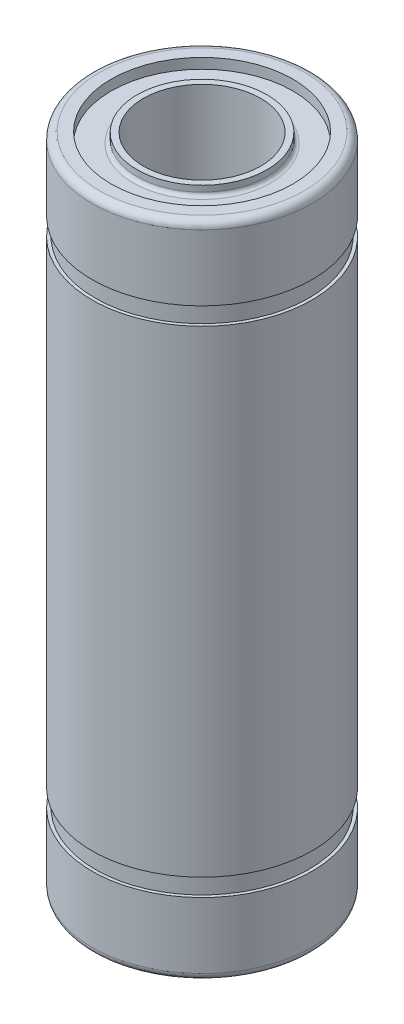
ISO-10303-21;
HEADER;
FILE_DESCRIPTION(('STEP AP214'),'2;1');
FILE_NAME('part.step','',(''),(''),'','','');
FILE_SCHEMA(('AUTOMOTIVE_DESIGN { 1 0 10303 214 1 1 1 1 }'));
ENDSEC;
DATA;
#1=APPLICATION_CONTEXT('core data for automotive mechanical design processes');
#2=APPLICATION_PROTOCOL_DEFINITION('international standard','automotive_design',2000,#1);
#3=PRODUCT_CONTEXT('',#1,'mechanical');
#4=PRODUCT('Part','Part','',(#3));
#5=PRODUCT_RELATED_PRODUCT_CATEGORY('part','',(#4));
#6=PRODUCT_DEFINITION_FORMATION('','',#4);
#7=PRODUCT_DEFINITION_CONTEXT('part definition',#1,'design');
#8=PRODUCT_DEFINITION('design','',#6,#7);
#9=PRODUCT_DEFINITION_SHAPE('','',#8);
#10=(LENGTH_UNIT() NAMED_UNIT(*) SI_UNIT(.MILLI.,.METRE.));
#11=(NAMED_UNIT(*) PLANE_ANGLE_UNIT() SI_UNIT($,.RADIAN.));
#12=(NAMED_UNIT(*) SI_UNIT($,.STERADIAN.) SOLID_ANGLE_UNIT());
#13=UNCERTAINTY_MEASURE_WITH_UNIT(LENGTH_MEASURE(1.E-05),#10,'distance_accuracy_value','');
#14=(GEOMETRIC_REPRESENTATION_CONTEXT(3) GLOBAL_UNCERTAINTY_ASSIGNED_CONTEXT((#13)) GLOBAL_UNIT_ASSIGNED_CONTEXT((#10,
#11,#12)) REPRESENTATION_CONTEXT('',''));
#15=CARTESIAN_POINT('',(0.,0.,0.));
#16=DIRECTION('',(0.,0.,1.));
#17=DIRECTION('',(1.,0.,0.));
#18=AXIS2_PLACEMENT_3D('',#15,#16,#17);
#19=CARTESIAN_POINT('',(0.,22.4412500020371,0.));
#20=DIRECTION('',(0.,-1.,0.));
#21=DIRECTION('',(0.,0.,-1.));
#22=AXIS2_PLACEMENT_3D('',#19,#20,#21);
#23=CYLINDRICAL_SURFACE('',#22,4.425);
#24=CARTESIAN_POINT('',(0.,22.4004,0.));
#25=DIRECTION('',(0.,-1.,0.));
#26=DIRECTION('',(0.,0.,-1.));
#27=AXIS2_PLACEMENT_3D('',#24,#25,#26);
#28=CIRCLE('',#27,4.425);
#29=CARTESIAN_POINT('',(0.,22.4004,-4.425));
#30=VERTEX_POINT('',#29);
#31=EDGE_CURVE('E107',#30,#30,#28,.T.);
#32=ORIENTED_EDGE('',*,*,#31,.T.);
#33=EDGE_LOOP('',(#32));
#34=FACE_BOUND('',#33,.T.);
#35=CARTESIAN_POINT('',(0.,21.994,0.));
#36=DIRECTION('',(0.,-1.,0.));
#37=DIRECTION('',(0.,0.,-1.));
#38=AXIS2_PLACEMENT_3D('',#35,#36,#37);
#39=CIRCLE('',#38,4.425);
#40=CARTESIAN_POINT('',(0.,21.994,-4.425));
#41=VERTEX_POINT('',#40);
#42=EDGE_CURVE('E10',#41,#41,#39,.T.);
#43=ORIENTED_EDGE('',*,*,#42,.F.);
#44=EDGE_LOOP('',(#43));
#45=FACE_BOUND('',#44,.T.);
#46=ADVANCED_FACE('F31',(#34,#45),#23,.T.);
#47=CARTESIAN_POINT('',(0.,21.994,0.));
#48=DIRECTION('',(0.,-1.,0.));
#49=DIRECTION('',(0.,0.,-1.));
#50=AXIS2_PLACEMENT_3D('',#47,#48,#49);
#51=TOROIDAL_SURFACE('',#50,4.679,0.254);
#52=ORIENTED_EDGE('',*,*,#42,.T.);
#53=EDGE_LOOP('',(#52));
#54=FACE_BOUND('',#53,.T.);
#55=CARTESIAN_POINT('',(0.,21.74,0.));
#56=DIRECTION('',(0.,-1.,0.));
#57=DIRECTION('',(0.,0.,-1.));
#58=AXIS2_PLACEMENT_3D('',#55,#56,#57);
#59=CIRCLE('',#58,4.679);
#60=CARTESIAN_POINT('',(0.,21.74,-4.679));
#61=VERTEX_POINT('',#60);
#62=EDGE_CURVE('E37',#61,#61,#59,.T.);
#63=ORIENTED_EDGE('',*,*,#62,.F.);
#64=EDGE_LOOP('',(#63));
#65=FACE_BOUND('',#64,.T.);
#66=ADVANCED_FACE('F125',(#54,#65),#51,.F.);
#67=CARTESIAN_POINT('',(6.19,21.74,0.));
#68=DIRECTION('',(0.,1.,0.));
#69=DIRECTION('',(0.,0.,1.));
#70=AXIS2_PLACEMENT_3D('',#67,#68,#69);
#71=PLANE('',#70);
#72=ORIENTED_EDGE('',*,*,#62,.T.);
#73=EDGE_LOOP('',(#72));
#74=FACE_BOUND('',#73,.T.);
#75=CARTESIAN_POINT('',(0.,21.74,0.));
#76=DIRECTION('',(0.,-1.,0.));
#77=DIRECTION('',(0.,0.,-1.));
#78=AXIS2_PLACEMENT_3D('',#75,#76,#77);
#79=CIRCLE('',#78,6.19);
#80=CARTESIAN_POINT('',(0.,21.74,-6.19));
#81=VERTEX_POINT('',#80);
#82=EDGE_CURVE('E41',#81,#81,#79,.T.);
#83=ORIENTED_EDGE('',*,*,#82,.F.);
#84=EDGE_LOOP('',(#83));
#85=FACE_BOUND('',#84,.T.);
#86=ADVANCED_FACE('F129',(#74,#85),#71,.T.);
#87=CARTESIAN_POINT('',(0.,22.4412500020371,0.));
#88=DIRECTION('',(0.,-1.,0.));
#89=DIRECTION('',(0.,0.,-1.));
#90=AXIS2_PLACEMENT_3D('',#87,#88,#89);
#91=CYLINDRICAL_SURFACE('',#90,6.19);
#92=ORIENTED_EDGE('',*,*,#82,.T.);
#93=EDGE_LOOP('',(#92));
#94=FACE_BOUND('',#93,.T.);
#95=CARTESIAN_POINT('',(0.,22.44,0.));
#96=DIRECTION('',(0.,-1.,0.));
#97=DIRECTION('',(0.,0.,-1.));
#98=AXIS2_PLACEMENT_3D('',#95,#96,#97);
#99=CIRCLE('',#98,6.19);
#100=CARTESIAN_POINT('',(0.,22.44,-6.19));
#101=VERTEX_POINT('',#100);
#102=EDGE_CURVE('E45',#101,#101,#99,.T.);
#103=ORIENTED_EDGE('',*,*,#102,.F.);
#104=EDGE_LOOP('',(#103));
#105=FACE_BOUND('',#104,.T.);
#106=ADVANCED_FACE('F133',(#94,#105),#91,.F.);
#107=CARTESIAN_POINT('',(6.982,22.44,0.));
#108=DIRECTION('',(0.,1.,0.));
#109=DIRECTION('',(0.,0.,1.));
#110=AXIS2_PLACEMENT_3D('',#107,#108,#109);
#111=PLANE('',#110);
#112=ORIENTED_EDGE('',*,*,#102,.T.);
#113=EDGE_LOOP('',(#112));
#114=FACE_BOUND('',#113,.T.);
#115=CARTESIAN_POINT('',(0.,22.44,0.));
#116=DIRECTION('',(0.,-1.,0.));
#117=DIRECTION('',(0.,0.,-1.));
#118=AXIS2_PLACEMENT_3D('',#115,#116,#117);
#119=CIRCLE('',#118,6.982);
#120=CARTESIAN_POINT('',(0.,22.44,-6.982));
#121=VERTEX_POINT('',#120);
#122=EDGE_CURVE('E50',#121,#121,#119,.T.);
#123=ORIENTED_EDGE('',*,*,#122,.F.);
#124=EDGE_LOOP('',(#123));
#125=FACE_BOUND('',#124,.T.);
#126=ADVANCED_FACE('F139',(#114,#125),#111,.T.);
#127=CARTESIAN_POINT('',(0.,21.932,0.));
#128=DIRECTION('',(0.,-1.,0.));
#129=DIRECTION('',(0.,0.,-1.));
#130=AXIS2_PLACEMENT_3D('',#127,#128,#129);
#131=TOROIDAL_SURFACE('',#130,6.982,0.508000000000001);
#132=ORIENTED_EDGE('',*,*,#122,.T.);
#133=EDGE_LOOP('',(#132));
#134=FACE_BOUND('',#133,.T.);
#135=CARTESIAN_POINT('',(0.,21.932,0.));
#136=DIRECTION('',(0.,-1.,0.));
#137=DIRECTION('',(0.,0.,-1.));
#138=AXIS2_PLACEMENT_3D('',#135,#136,#137);
#139=CIRCLE('',#138,7.49);
#140=CARTESIAN_POINT('',(0.,21.932,-7.49));
#141=VERTEX_POINT('',#140);
#142=EDGE_CURVE('E53',#141,#141,#139,.T.);
#143=ORIENTED_EDGE('',*,*,#142,.F.);
#144=EDGE_LOOP('',(#143));
#145=FACE_BOUND('',#144,.T.);
#146=ADVANCED_FACE('F143',(#134,#145),#131,.T.);
#147=CARTESIAN_POINT('',(0.,22.4412500020371,0.));
#148=DIRECTION('',(0.,-1.,0.));
#149=DIRECTION('',(0.,0.,-1.));
#150=AXIS2_PLACEMENT_3D('',#147,#148,#149);
#151=CYLINDRICAL_SURFACE('',#150,7.49);
#152=ORIENTED_EDGE('',*,*,#142,.T.);
#153=EDGE_LOOP('',(#152));
#154=FACE_BOUND('',#153,.T.);
#155=CARTESIAN_POINT('',(0.,17.45,0.));
#156=DIRECTION('',(0.,-1.,0.));
#157=DIRECTION('',(0.,0.,-1.));
#158=AXIS2_PLACEMENT_3D('',#155,#156,#157);
#159=CIRCLE('',#158,7.49);
#160=CARTESIAN_POINT('',(0.,17.45,-7.49));
#161=VERTEX_POINT('',#160);
#162=EDGE_CURVE('E56',#161,#161,#159,.T.);
#163=ORIENTED_EDGE('',*,*,#162,.F.);
#164=EDGE_LOOP('',(#163));
#165=FACE_BOUND('',#164,.T.);
#166=ADVANCED_FACE('F147',(#154,#165),#151,.T.);
#167=CARTESIAN_POINT('',(7.275,17.45,0.));
#168=DIRECTION('',(0.,-1.,0.));
#169=DIRECTION('',(0.,0.,-1.));
#170=AXIS2_PLACEMENT_3D('',#167,#168,#169);
#171=PLANE('',#170);
#172=ORIENTED_EDGE('',*,*,#162,.T.);
#173=EDGE_LOOP('',(#172));
#174=FACE_BOUND('',#173,.T.);
#175=CARTESIAN_POINT('',(0.,17.45,0.));
#176=DIRECTION('',(0.,-1.,0.));
#177=DIRECTION('',(0.,0.,-1.));
#178=AXIS2_PLACEMENT_3D('',#175,#176,#177);
#179=CIRCLE('',#178,7.275);
#180=CARTESIAN_POINT('',(0.,17.45,-7.275));
#181=VERTEX_POINT('',#180);
#182=EDGE_CURVE('E59',#181,#181,#179,.T.);
#183=ORIENTED_EDGE('',*,*,#182,.F.);
#184=EDGE_LOOP('',(#183));
#185=FACE_BOUND('',#184,.T.);
#186=ADVANCED_FACE('F151',(#174,#185),#171,.T.);
#187=CARTESIAN_POINT('',(0.,22.4412500020371,0.));
#188=DIRECTION('',(0.,-1.,0.));
#189=DIRECTION('',(0.,0.,-1.));
#190=AXIS2_PLACEMENT_3D('',#187,#188,#189);
#191=CYLINDRICAL_SURFACE('',#190,7.275);
#192=ORIENTED_EDGE('',*,*,#182,.T.);
#193=EDGE_LOOP('',(#192));
#194=FACE_BOUND('',#193,.T.);
#195=CARTESIAN_POINT('',(0.,16.25,0.));
#196=DIRECTION('',(0.,-1.,0.));
#197=DIRECTION('',(0.,0.,-1.));
#198=AXIS2_PLACEMENT_3D('',#195,#196,#197);
#199=CIRCLE('',#198,7.275);
#200=CARTESIAN_POINT('',(0.,16.25,-7.275));
#201=VERTEX_POINT('',#200);
#202=EDGE_CURVE('E62',#201,#201,#199,.T.);
#203=ORIENTED_EDGE('',*,*,#202,.F.);
#204=EDGE_LOOP('',(#203));
#205=FACE_BOUND('',#204,.T.);
#206=ADVANCED_FACE('F155',(#194,#205),#191,.T.);
#207=CARTESIAN_POINT('',(7.49,16.25,0.));
#208=DIRECTION('',(0.,1.,0.));
#209=DIRECTION('',(0.,0.,1.));
#210=AXIS2_PLACEMENT_3D('',#207,#208,#209);
#211=PLANE('',#210);
#212=ORIENTED_EDGE('',*,*,#202,.T.);
#213=EDGE_LOOP('',(#212));
#214=FACE_BOUND('',#213,.T.);
#215=CARTESIAN_POINT('',(0.,16.25,0.));
#216=DIRECTION('',(0.,-1.,0.));
#217=DIRECTION('',(0.,0.,-1.));
#218=AXIS2_PLACEMENT_3D('',#215,#216,#217);
#219=CIRCLE('',#218,7.49);
#220=CARTESIAN_POINT('',(0.,16.25,-7.49));
#221=VERTEX_POINT('',#220);
#222=EDGE_CURVE('E65',#221,#221,#219,.T.);
#223=ORIENTED_EDGE('',*,*,#222,.F.);
#224=EDGE_LOOP('',(#223));
#225=FACE_BOUND('',#224,.T.);
#226=ADVANCED_FACE('F159',(#214,#225),#211,.T.);
#227=CARTESIAN_POINT('',(0.,22.4412500020371,0.));
#228=DIRECTION('',(0.,-1.,0.));
#229=DIRECTION('',(0.,0.,-1.));
#230=AXIS2_PLACEMENT_3D('',#227,#228,#229);
#231=CYLINDRICAL_SURFACE('',#230,7.49);
#232=ORIENTED_EDGE('',*,*,#222,.T.);
#233=EDGE_LOOP('',(#232));
#234=FACE_BOUND('',#233,.T.);
#235=CARTESIAN_POINT('',(0.,-16.25,0.));
#236=DIRECTION('',(0.,-1.,0.));
#237=DIRECTION('',(0.,0.,-1.));
#238=AXIS2_PLACEMENT_3D('',#235,#236,#237);
#239=CIRCLE('',#238,7.49);
#240=CARTESIAN_POINT('',(0.,-16.25,-7.49));
#241=VERTEX_POINT('',#240);
#242=EDGE_CURVE('E68',#241,#241,#239,.T.);
#243=ORIENTED_EDGE('',*,*,#242,.F.);
#244=EDGE_LOOP('',(#243));
#245=FACE_BOUND('',#244,.T.);
#246=ADVANCED_FACE('F163',(#234,#245),#231,.T.);
#247=CARTESIAN_POINT('',(7.275,-16.25,0.));
#248=DIRECTION('',(0.,-1.,0.));
#249=DIRECTION('',(0.,0.,-1.));
#250=AXIS2_PLACEMENT_3D('',#247,#248,#249);
#251=PLANE('',#250);
#252=ORIENTED_EDGE('',*,*,#242,.T.);
#253=EDGE_LOOP('',(#252));
#254=FACE_BOUND('',#253,.T.);
#255=CARTESIAN_POINT('',(0.,-16.25,0.));
#256=DIRECTION('',(0.,-1.,0.));
#257=DIRECTION('',(0.,0.,-1.));
#258=AXIS2_PLACEMENT_3D('',#255,#256,#257);
#259=CIRCLE('',#258,7.275);
#260=CARTESIAN_POINT('',(0.,-16.25,-7.275));
#261=VERTEX_POINT('',#260);
#262=EDGE_CURVE('E71',#261,#261,#259,.T.);
#263=ORIENTED_EDGE('',*,*,#262,.F.);
#264=EDGE_LOOP('',(#263));
#265=FACE_BOUND('',#264,.T.);
#266=ADVANCED_FACE('F167',(#254,#265),#251,.T.);
#267=CARTESIAN_POINT('',(0.,22.4412500020371,0.));
#268=DIRECTION('',(0.,-1.,0.));
#269=DIRECTION('',(0.,0.,-1.));
#270=AXIS2_PLACEMENT_3D('',#267,#268,#269);
#271=CYLINDRICAL_SURFACE('',#270,7.275);
#272=ORIENTED_EDGE('',*,*,#262,.T.);
#273=EDGE_LOOP('',(#272));
#274=FACE_BOUND('',#273,.T.);
#275=CARTESIAN_POINT('',(0.,-17.45,0.));
#276=DIRECTION('',(0.,-1.,0.));
#277=DIRECTION('',(0.,0.,-1.));
#278=AXIS2_PLACEMENT_3D('',#275,#276,#277);
#279=CIRCLE('',#278,7.275);
#280=CARTESIAN_POINT('',(0.,-17.45,-7.275));
#281=VERTEX_POINT('',#280);
#282=EDGE_CURVE('E74',#281,#281,#279,.T.);
#283=ORIENTED_EDGE('',*,*,#282,.F.);
#284=EDGE_LOOP('',(#283));
#285=FACE_BOUND('',#284,.T.);
#286=ADVANCED_FACE('F171',(#274,#285),#271,.T.);
#287=CARTESIAN_POINT('',(7.49,-17.45,0.));
#288=DIRECTION('',(0.,1.,0.));
#289=DIRECTION('',(0.,0.,1.));
#290=AXIS2_PLACEMENT_3D('',#287,#288,#289);
#291=PLANE('',#290);
#292=ORIENTED_EDGE('',*,*,#282,.T.);
#293=EDGE_LOOP('',(#292));
#294=FACE_BOUND('',#293,.T.);
#295=CARTESIAN_POINT('',(0.,-17.45,0.));
#296=DIRECTION('',(0.,-1.,0.));
#297=DIRECTION('',(0.,0.,-1.));
#298=AXIS2_PLACEMENT_3D('',#295,#296,#297);
#299=CIRCLE('',#298,7.49);
#300=CARTESIAN_POINT('',(0.,-17.45,-7.49));
#301=VERTEX_POINT('',#300);
#302=EDGE_CURVE('E77',#301,#301,#299,.T.);
#303=ORIENTED_EDGE('',*,*,#302,.F.);
#304=EDGE_LOOP('',(#303));
#305=FACE_BOUND('',#304,.T.);
#306=ADVANCED_FACE('F175',(#294,#305),#291,.T.);
#307=CARTESIAN_POINT('',(0.,22.4412500020371,0.));
#308=DIRECTION('',(0.,-1.,0.));
#309=DIRECTION('',(0.,0.,-1.));
#310=AXIS2_PLACEMENT_3D('',#307,#308,#309);
#311=CYLINDRICAL_SURFACE('',#310,7.49);
#312=ORIENTED_EDGE('',*,*,#302,.T.);
#313=EDGE_LOOP('',(#312));
#314=FACE_BOUND('',#313,.T.);
#315=CARTESIAN_POINT('',(0.,-21.932,0.));
#316=DIRECTION('',(0.,-1.,0.));
#317=DIRECTION('',(0.,0.,-1.));
#318=AXIS2_PLACEMENT_3D('',#315,#316,#317);
#319=CIRCLE('',#318,7.49);
#320=CARTESIAN_POINT('',(0.,-21.932,-7.49));
#321=VERTEX_POINT('',#320);
#322=EDGE_CURVE('E80',#321,#321,#319,.T.);
#323=ORIENTED_EDGE('',*,*,#322,.F.);
#324=EDGE_LOOP('',(#323));
#325=FACE_BOUND('',#324,.T.);
#326=ADVANCED_FACE('F179',(#314,#325),#311,.T.);
#327=CARTESIAN_POINT('',(0.,-21.932,0.));
#328=DIRECTION('',(0.,-1.,0.));
#329=DIRECTION('',(0.,0.,-1.));
#330=AXIS2_PLACEMENT_3D('',#327,#328,#329);
#331=TOROIDAL_SURFACE('',#330,6.982,0.508000000000001);
#332=ORIENTED_EDGE('',*,*,#322,.T.);
#333=EDGE_LOOP('',(#332));
#334=FACE_BOUND('',#333,.T.);
#335=CARTESIAN_POINT('',(0.,-22.44,0.));
#336=DIRECTION('',(0.,-1.,0.));
#337=DIRECTION('',(0.,0.,-1.));
#338=AXIS2_PLACEMENT_3D('',#335,#336,#337);
#339=CIRCLE('',#338,6.98200000000008);
#340=CARTESIAN_POINT('',(0.,-22.44,-6.98200000000008));
#341=VERTEX_POINT('',#340);
#342=EDGE_CURVE('E83',#341,#341,#339,.T.);
#343=ORIENTED_EDGE('',*,*,#342,.F.);
#344=EDGE_LOOP('',(#343));
#345=FACE_BOUND('',#344,.T.);
#346=ADVANCED_FACE('F183',(#334,#345),#331,.T.);
#347=CARTESIAN_POINT('',(6.19,-22.44,0.));
#348=DIRECTION('',(0.,-1.,0.));
#349=DIRECTION('',(0.,0.,-1.));
#350=AXIS2_PLACEMENT_3D('',#347,#348,#349);
#351=PLANE('',#350);
#352=ORIENTED_EDGE('',*,*,#342,.T.);
#353=EDGE_LOOP('',(#352));
#354=FACE_BOUND('',#353,.T.);
#355=CARTESIAN_POINT('',(0.,-22.44,0.));
#356=DIRECTION('',(0.,-1.,0.));
#357=DIRECTION('',(0.,0.,-1.));
#358=AXIS2_PLACEMENT_3D('',#355,#356,#357);
#359=CIRCLE('',#358,6.19);
#360=CARTESIAN_POINT('',(0.,-22.44,-6.19));
#361=VERTEX_POINT('',#360);
#362=EDGE_CURVE('E86',#361,#361,#359,.T.);
#363=ORIENTED_EDGE('',*,*,#362,.F.);
#364=EDGE_LOOP('',(#363));
#365=FACE_BOUND('',#364,.T.);
#366=ADVANCED_FACE('F187',(#354,#365),#351,.T.);
#367=CARTESIAN_POINT('',(0.,22.4412500020371,0.));
#368=DIRECTION('',(0.,-1.,0.));
#369=DIRECTION('',(0.,0.,-1.));
#370=AXIS2_PLACEMENT_3D('',#367,#368,#369);
#371=CYLINDRICAL_SURFACE('',#370,6.19);
#372=ORIENTED_EDGE('',*,*,#362,.T.);
#373=EDGE_LOOP('',(#372));
#374=FACE_BOUND('',#373,.T.);
#375=CARTESIAN_POINT('',(0.,-21.74,0.));
#376=DIRECTION('',(0.,-1.,0.));
#377=DIRECTION('',(0.,0.,-1.));
#378=AXIS2_PLACEMENT_3D('',#375,#376,#377);
#379=CIRCLE('',#378,6.19);
#380=CARTESIAN_POINT('',(0.,-21.74,-6.19));
#381=VERTEX_POINT('',#380);
#382=EDGE_CURVE('E89',#381,#381,#379,.T.);
#383=ORIENTED_EDGE('',*,*,#382,.F.);
#384=EDGE_LOOP('',(#383));
#385=FACE_BOUND('',#384,.T.);
#386=ADVANCED_FACE('F191',(#374,#385),#371,.F.);
#387=CARTESIAN_POINT('',(4.679,-21.74,0.));
#388=DIRECTION('',(0.,-1.,0.));
#389=DIRECTION('',(0.,0.,-1.));
#390=AXIS2_PLACEMENT_3D('',#387,#388,#389);
#391=PLANE('',#390);
#392=ORIENTED_EDGE('',*,*,#382,.T.);
#393=EDGE_LOOP('',(#392));
#394=FACE_BOUND('',#393,.T.);
#395=CARTESIAN_POINT('',(0.,-21.74,0.));
#396=DIRECTION('',(0.,-1.,0.));
#397=DIRECTION('',(0.,0.,-1.));
#398=AXIS2_PLACEMENT_3D('',#395,#396,#397);
#399=CIRCLE('',#398,4.679);
#400=CARTESIAN_POINT('',(0.,-21.74,-4.679));
#401=VERTEX_POINT('',#400);
#402=EDGE_CURVE('E92',#401,#401,#399,.T.);
#403=ORIENTED_EDGE('',*,*,#402,.F.);
#404=EDGE_LOOP('',(#403));
#405=FACE_BOUND('',#404,.T.);
#406=ADVANCED_FACE('F195',(#394,#405),#391,.T.);
#407=CARTESIAN_POINT('',(0.,-21.994,0.));
#408=DIRECTION('',(0.,-1.,0.));
#409=DIRECTION('',(0.,0.,-1.));
#410=AXIS2_PLACEMENT_3D('',#407,#408,#409);
#411=TOROIDAL_SURFACE('',#410,4.679,0.254);
#412=ORIENTED_EDGE('',*,*,#402,.T.);
#413=EDGE_LOOP('',(#412));
#414=FACE_BOUND('',#413,.T.);
#415=CARTESIAN_POINT('',(0.,-21.994,0.));
#416=DIRECTION('',(0.,-1.,0.));
#417=DIRECTION('',(0.,0.,-1.));
#418=AXIS2_PLACEMENT_3D('',#415,#416,#417);
#419=CIRCLE('',#418,4.425);
#420=CARTESIAN_POINT('',(0.,-21.994,-4.425));
#421=VERTEX_POINT('',#420);
#422=EDGE_CURVE('E95',#421,#421,#419,.T.);
#423=ORIENTED_EDGE('',*,*,#422,.F.);
#424=EDGE_LOOP('',(#423));
#425=FACE_BOUND('',#424,.T.);
#426=ADVANCED_FACE('F199',(#414,#425),#411,.F.);
#427=CARTESIAN_POINT('',(0.,22.4412500020371,0.));
#428=DIRECTION('',(0.,-1.,0.));
#429=DIRECTION('',(0.,0.,-1.));
#430=AXIS2_PLACEMENT_3D('',#427,#428,#429);
#431=CYLINDRICAL_SURFACE('',#430,4.425);
#432=ORIENTED_EDGE('',*,*,#422,.T.);
#433=EDGE_LOOP('',(#432));
#434=FACE_BOUND('',#433,.T.);
#435=CARTESIAN_POINT('',(0.,-22.4004,0.));
#436=DIRECTION('',(0.,-1.,0.));
#437=DIRECTION('',(0.,0.,-1.));
#438=AXIS2_PLACEMENT_3D('',#435,#436,#437);
#439=CIRCLE('',#438,4.425);
#440=CARTESIAN_POINT('',(0.,-22.4004,-4.425));
#441=VERTEX_POINT('',#440);
#442=EDGE_CURVE('E98',#441,#441,#439,.T.);
#443=ORIENTED_EDGE('',*,*,#442,.F.);
#444=EDGE_LOOP('',(#443));
#445=FACE_BOUND('',#444,.T.);
#446=ADVANCED_FACE('F203',(#434,#445),#431,.T.);
#447=CARTESIAN_POINT('',(4.,-22.4004,0.));
#448=DIRECTION('',(0.,-1.,0.));
#449=DIRECTION('',(0.,0.,-1.));
#450=AXIS2_PLACEMENT_3D('',#447,#448,#449);
#451=PLANE('',#450);
#452=ORIENTED_EDGE('',*,*,#442,.T.);
#453=EDGE_LOOP('',(#452));
#454=FACE_BOUND('',#453,.T.);
#455=CARTESIAN_POINT('',(0.,-22.4004,0.));
#456=DIRECTION('',(0.,-1.,0.));
#457=DIRECTION('',(0.,0.,-1.));
#458=AXIS2_PLACEMENT_3D('',#455,#456,#457);
#459=CIRCLE('',#458,4.);
#460=CARTESIAN_POINT('',(0.,-22.4004,-4.));
#461=VERTEX_POINT('',#460);
#462=EDGE_CURVE('E101',#461,#461,#459,.T.);
#463=ORIENTED_EDGE('',*,*,#462,.F.);
#464=EDGE_LOOP('',(#463));
#465=FACE_BOUND('',#464,.T.);
#466=ADVANCED_FACE('F121',(#454,#465),#451,.T.);
#467=CARTESIAN_POINT('',(0.,22.4412500020371,0.));
#468=DIRECTION('',(0.,-1.,0.));
#469=DIRECTION('',(0.,0.,-1.));
#470=AXIS2_PLACEMENT_3D('',#467,#468,#469);
#471=CYLINDRICAL_SURFACE('',#470,4.);
#472=ORIENTED_EDGE('',*,*,#462,.T.);
#473=EDGE_LOOP('',(#472));
#474=FACE_BOUND('',#473,.T.);
#475=CARTESIAN_POINT('',(0.,22.4004,0.));
#476=DIRECTION('',(0.,-1.,0.));
#477=DIRECTION('',(0.,0.,-1.));
#478=AXIS2_PLACEMENT_3D('',#475,#476,#477);
#479=CIRCLE('',#478,4.);
#480=CARTESIAN_POINT('',(0.,22.4004,-4.));
#481=VERTEX_POINT('',#480);
#482=EDGE_CURVE('E104',#481,#481,#479,.T.);
#483=ORIENTED_EDGE('',*,*,#482,.F.);
#484=EDGE_LOOP('',(#483));
#485=FACE_BOUND('',#484,.T.);
#486=ADVANCED_FACE('F115',(#474,#485),#471,.F.);
#487=CARTESIAN_POINT('',(4.425,22.4004,0.));
#488=DIRECTION('',(0.,1.,0.));
#489=DIRECTION('',(0.,0.,1.));
#490=AXIS2_PLACEMENT_3D('',#487,#488,#489);
#491=PLANE('',#490);
#492=ORIENTED_EDGE('',*,*,#482,.T.);
#493=EDGE_LOOP('',(#492));
#494=FACE_BOUND('',#493,.T.);
#495=ORIENTED_EDGE('',*,*,#31,.F.);
#496=EDGE_LOOP('',(#495));
#497=FACE_BOUND('',#496,.T.);
#498=ADVANCED_FACE('F113',(#494,#497),#491,.T.);
#499=CLOSED_SHELL('',(#46,#66,#86,#106,#126,#146,#166,#186,#206,#226,#246,#266,#286,#306,#326,
#346,#366,#386,#406,#426,#446,#466,#486,#498));
#500=MANIFOLD_SOLID_BREP('B2',#499);
#501=ADVANCED_BREP_SHAPE_REPRESENTATION('',(#18,#500),#14);
#502=SHAPE_DEFINITION_REPRESENTATION(#9,#501);
ENDSEC;
END-ISO-10303-21;
